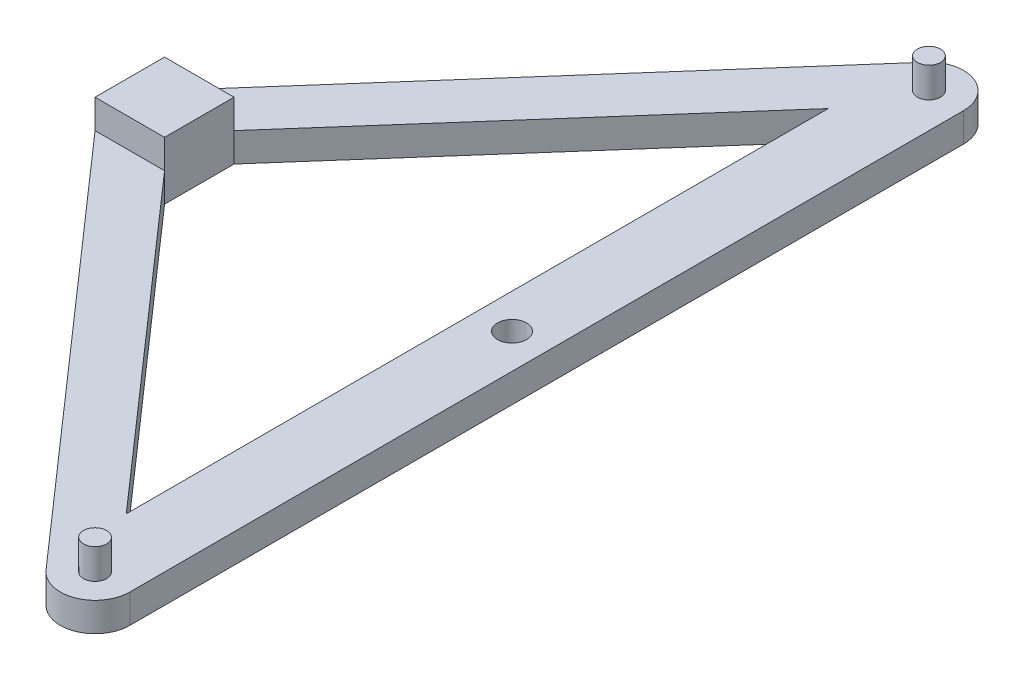
ISO-10303-21;
HEADER;
FILE_DESCRIPTION(('STEP AP214'),'2;1');
FILE_NAME('part.step','',(''),(''),'','','');
FILE_SCHEMA(('AUTOMOTIVE_DESIGN { 1 0 10303 214 1 1 1 1 }'));
ENDSEC;
DATA;
#1=APPLICATION_CONTEXT('core data for automotive mechanical design processes');
#2=APPLICATION_PROTOCOL_DEFINITION('international standard','automotive_design',2000,#1);
#3=PRODUCT_CONTEXT('',#1,'mechanical');
#4=PRODUCT('Part','Part','',(#3));
#5=PRODUCT_RELATED_PRODUCT_CATEGORY('part','',(#4));
#6=PRODUCT_DEFINITION_FORMATION('','',#4);
#7=PRODUCT_DEFINITION_CONTEXT('part definition',#1,'design');
#8=PRODUCT_DEFINITION('design','',#6,#7);
#9=PRODUCT_DEFINITION_SHAPE('','',#8);
#10=(LENGTH_UNIT() NAMED_UNIT(*) SI_UNIT(.MILLI.,.METRE.));
#11=(NAMED_UNIT(*) PLANE_ANGLE_UNIT() SI_UNIT($,.RADIAN.));
#12=(NAMED_UNIT(*) SI_UNIT($,.STERADIAN.) SOLID_ANGLE_UNIT());
#13=UNCERTAINTY_MEASURE_WITH_UNIT(LENGTH_MEASURE(1.E-05),#10,'distance_accuracy_value','');
#14=(GEOMETRIC_REPRESENTATION_CONTEXT(3) GLOBAL_UNCERTAINTY_ASSIGNED_CONTEXT((#13)) GLOBAL_UNIT_ASSIGNED_CONTEXT((#10,
#11,#12)) REPRESENTATION_CONTEXT('',''));
#15=CARTESIAN_POINT('',(0.,0.,0.));
#16=DIRECTION('',(0.,0.,1.));
#17=DIRECTION('',(1.,0.,0.));
#18=AXIS2_PLACEMENT_3D('',#15,#16,#17);
#19=CARTESIAN_POINT('',(3.81,3.175,0.));
#20=DIRECTION('',(1.,0.,0.));
#21=DIRECTION('',(0.,0.,-1.));
#22=AXIS2_PLACEMENT_3D('',#19,#20,#21);
#23=PLANE('',#22);
#24=DIRECTION('',(0.,0.,1.));
#25=VECTOR('',#24,1.);
#26=CARTESIAN_POINT('',(3.81,0.,0.));
#27=LINE('',#26,#25);
#28=CARTESIAN_POINT('',(3.80999999999999,0.,-45.72));
#29=VERTEX_POINT('',#28);
#30=CARTESIAN_POINT('',(3.81,0.,45.72));
#31=VERTEX_POINT('',#30);
#32=EDGE_CURVE('E143',#29,#31,#27,.T.);
#33=ORIENTED_EDGE('',*,*,#32,.F.);
#34=DIRECTION('',(0.,-1.,0.));
#35=VECTOR('',#34,1.);
#36=CARTESIAN_POINT('',(3.80999999999999,3.175,-45.72));
#37=LINE('',#36,#35);
#38=CARTESIAN_POINT('',(3.80999999999999,3.175,-45.72));
#39=VERTEX_POINT('',#38);
#40=EDGE_CURVE('E11',#39,#29,#37,.T.);
#41=ORIENTED_EDGE('',*,*,#40,.F.);
#42=DIRECTION('',(0.,0.,1.));
#43=VECTOR('',#42,1.);
#44=CARTESIAN_POINT('',(3.81,3.175,0.));
#45=LINE('',#44,#43);
#46=CARTESIAN_POINT('',(3.81,3.175,45.72));
#47=VERTEX_POINT('',#46);
#48=EDGE_CURVE('E161',#39,#47,#45,.T.);
#49=ORIENTED_EDGE('',*,*,#48,.T.);
#50=DIRECTION('',(0.,-1.,0.));
#51=VECTOR('',#50,1.);
#52=CARTESIAN_POINT('',(3.81,3.175,45.72));
#53=LINE('',#52,#51);
#54=EDGE_CURVE('E85',#47,#31,#53,.T.);
#55=ORIENTED_EDGE('',*,*,#54,.T.);
#56=EDGE_LOOP('',(#33,#41,#49,#55));
#57=FACE_BOUND('',#56,.T.);
#58=ADVANCED_FACE('F33',(#57),#23,.T.);
#59=CARTESIAN_POINT('',(0.,3.175,-45.72));
#60=DIRECTION('',(0.,-1.,0.));
#61=DIRECTION('',(0.,0.,-1.));
#62=AXIS2_PLACEMENT_3D('',#59,#60,#61);
#63=CYLINDRICAL_SURFACE('',#62,3.81000000000001);
#64=CARTESIAN_POINT('',(0.,0.,-45.72));
#65=DIRECTION('',(0.,1.,0.));
#66=DIRECTION('',(0.,0.,1.));
#67=AXIS2_PLACEMENT_3D('',#64,#65,#66);
#68=CIRCLE('',#67,3.81000000000001);
#69=CARTESIAN_POINT('',(-2.8616866178523,0.,-48.2353229814887));
#70=VERTEX_POINT('',#69);
#71=EDGE_CURVE('E146',#29,#70,#68,.T.);
#72=ORIENTED_EDGE('',*,*,#71,.T.);
#73=DIRECTION('',(0.,-1.,0.));
#74=VECTOR('',#73,1.);
#75=CARTESIAN_POINT('',(-2.8616866178523,3.175,-48.2353229814887));
#76=LINE('',#75,#74);
#77=CARTESIAN_POINT('',(-2.8616866178523,3.175,-48.2353229814887));
#78=VERTEX_POINT('',#77);
#79=EDGE_CURVE('E41',#78,#70,#76,.T.);
#80=ORIENTED_EDGE('',*,*,#79,.F.);
#81=CARTESIAN_POINT('',(0.,3.175,-45.72));
#82=DIRECTION('',(0.,1.,0.));
#83=DIRECTION('',(0.,0.,1.));
#84=AXIS2_PLACEMENT_3D('',#81,#82,#83);
#85=CIRCLE('',#84,3.81000000000001);
#86=EDGE_CURVE('E216',#39,#78,#85,.T.);
#87=ORIENTED_EDGE('',*,*,#86,.F.);
#88=ORIENTED_EDGE('',*,*,#40,.T.);
#89=EDGE_LOOP('',(#72,#80,#87,#88));
#90=FACE_BOUND('',#89,.T.);
#91=ADVANCED_FACE('F182',(#90),#63,.T.);
#92=CARTESIAN_POINT('',(-25.5327609980176,3.175,-22.4424086545754));
#93=DIRECTION('',(-0.751098849830001,0.,-0.66018975892091));
#94=DIRECTION('',(-0.66018975892091,0.,0.751098849830001));
#95=AXIS2_PLACEMENT_3D('',#92,#93,#94);
#96=PLANE('',#95);
#97=DIRECTION('',(0.66018975892091,0.,-0.751098849830001));
#98=VECTOR('',#97,1.);
#99=CARTESIAN_POINT('',(-25.5327609980176,0.,-22.4424086545754));
#100=LINE('',#99,#98);
#101=CARTESIAN_POINT('',(-41.91,0.,-3.81));
#102=VERTEX_POINT('',#101);
#103=EDGE_CURVE('E150',#102,#70,#100,.T.);
#104=ORIENTED_EDGE('',*,*,#103,.F.);
#105=DIRECTION('',(0.,-1.,0.));
#106=VECTOR('',#105,1.);
#107=CARTESIAN_POINT('',(-41.91,3.175,-3.81));
#108=LINE('',#107,#106);
#109=CARTESIAN_POINT('',(-41.91,3.175,-3.81));
#110=VERTEX_POINT('',#109);
#111=EDGE_CURVE('E172',#110,#102,#108,.T.);
#112=ORIENTED_EDGE('',*,*,#111,.F.);
#113=DIRECTION('',(0.66018975892091,0.,-0.751098849830001));
#114=VECTOR('',#113,1.);
#115=CARTESIAN_POINT('',(-25.5327609980176,3.175,-22.4424086545754));
#116=LINE('',#115,#114);
#117=EDGE_CURVE('E179',#110,#78,#116,.T.);
#118=ORIENTED_EDGE('',*,*,#117,.T.);
#119=ORIENTED_EDGE('',*,*,#79,.T.);
#120=EDGE_LOOP('',(#104,#112,#118,#119));
#121=FACE_BOUND('',#120,.T.);
#122=ADVANCED_FACE('F177',(#121),#96,.T.);
#123=CARTESIAN_POINT('',(-21.2339419435321,3.175,-18.6638962578812));
#124=DIRECTION('',(-0.751098849830001,0.,-0.66018975892091));
#125=DIRECTION('',(-0.66018975892091,0.,0.751098849830001));
#126=AXIS2_PLACEMENT_3D('',#123,#124,#125);
#127=PLANE('',#126);
#128=DIRECTION('',(0.66018975892091,0.,-0.751098849830001));
#129=VECTOR('',#128,1.);
#130=CARTESIAN_POINT('',(-21.2339419435321,0.,-18.6638962578812));
#131=LINE('',#130,#129);
#132=CARTESIAN_POINT('',(-34.29,0.,-3.81));
#133=VERTEX_POINT('',#132);
#134=CARTESIAN_POINT('',(-3.81,0.,-38.4871403728501));
#135=VERTEX_POINT('',#134);
#136=EDGE_CURVE('E153',#133,#135,#131,.T.);
#137=ORIENTED_EDGE('',*,*,#136,.T.);
#138=DIRECTION('',(0.,-1.,0.));
#139=VECTOR('',#138,1.);
#140=CARTESIAN_POINT('',(-3.81,3.175,-38.4871403728501));
#141=LINE('',#140,#139);
#142=CARTESIAN_POINT('',(-3.81,3.175,-38.4871403728501));
#143=VERTEX_POINT('',#142);
#144=EDGE_CURVE('E128',#143,#135,#141,.T.);
#145=ORIENTED_EDGE('',*,*,#144,.F.);
#146=DIRECTION('',(0.66018975892091,0.,-0.751098849830001));
#147=VECTOR('',#146,1.);
#148=CARTESIAN_POINT('',(-21.2339419435321,3.175,-18.6638962578812));
#149=LINE('',#148,#147);
#150=CARTESIAN_POINT('',(-34.29,3.175,-3.81));
#151=VERTEX_POINT('',#150);
#152=EDGE_CURVE('E115',#151,#143,#149,.T.);
#153=ORIENTED_EDGE('',*,*,#152,.F.);
#154=DIRECTION('',(0.,-1.,0.));
#155=VECTOR('',#154,1.);
#156=CARTESIAN_POINT('',(-34.29,3.175,-3.81));
#157=LINE('',#156,#155);
#158=EDGE_CURVE('E169',#151,#133,#157,.T.);
#159=ORIENTED_EDGE('',*,*,#158,.T.);
#160=EDGE_LOOP('',(#137,#145,#153,#159));
#161=FACE_BOUND('',#160,.T.);
#162=ADVANCED_FACE('F225',(#161),#127,.F.);
#163=CARTESIAN_POINT('',(-3.81,3.175,0.));
#164=DIRECTION('',(1.,0.,0.));
#165=DIRECTION('',(0.,0.,-1.));
#166=AXIS2_PLACEMENT_3D('',#163,#164,#165);
#167=PLANE('',#166);
#168=DIRECTION('',(0.,0.,1.));
#169=VECTOR('',#168,1.);
#170=CARTESIAN_POINT('',(-3.81,0.,0.));
#171=LINE('',#170,#169);
#172=CARTESIAN_POINT('',(-3.81,0.,38.4871403728501));
#173=VERTEX_POINT('',#172);
#174=EDGE_CURVE('E124',#135,#173,#171,.T.);
#175=ORIENTED_EDGE('',*,*,#174,.T.);
#176=DIRECTION('',(0.,-1.,0.));
#177=VECTOR('',#176,1.);
#178=CARTESIAN_POINT('',(-3.81,3.175,38.4871403728501));
#179=LINE('',#178,#177);
#180=CARTESIAN_POINT('',(-3.81,3.175,38.4871403728501));
#181=VERTEX_POINT('',#180);
#182=EDGE_CURVE('E121',#181,#173,#179,.T.);
#183=ORIENTED_EDGE('',*,*,#182,.F.);
#184=DIRECTION('',(0.,0.,1.));
#185=VECTOR('',#184,1.);
#186=CARTESIAN_POINT('',(-3.81,3.175,0.));
#187=LINE('',#186,#185);
#188=EDGE_CURVE('E107',#143,#181,#187,.T.);
#189=ORIENTED_EDGE('',*,*,#188,.F.);
#190=ORIENTED_EDGE('',*,*,#144,.T.);
#191=EDGE_LOOP('',(#175,#183,#189,#190));
#192=FACE_BOUND('',#191,.T.);
#193=ADVANCED_FACE('F122',(#192),#167,.F.);
#194=CARTESIAN_POINT('',(-21.2339419435321,3.175,18.6638962578812));
#195=DIRECTION('',(0.751098849830001,0.,-0.66018975892091));
#196=DIRECTION('',(-0.66018975892091,0.,-0.751098849830001));
#197=AXIS2_PLACEMENT_3D('',#194,#195,#196);
#198=PLANE('',#197);
#199=DIRECTION('',(0.66018975892091,0.,0.751098849830001));
#200=VECTOR('',#199,1.);
#201=CARTESIAN_POINT('',(-21.2339419435321,0.,18.6638962578812));
#202=LINE('',#201,#200);
#203=CARTESIAN_POINT('',(-34.29,0.,3.81));
#204=VERTEX_POINT('',#203);
#205=EDGE_CURVE('E156',#204,#173,#202,.T.);
#206=ORIENTED_EDGE('',*,*,#205,.F.);
#207=DIRECTION('',(0.,-1.,0.));
#208=VECTOR('',#207,1.);
#209=CARTESIAN_POINT('',(-34.29,3.175,3.81));
#210=LINE('',#209,#208);
#211=CARTESIAN_POINT('',(-34.29,3.175,3.81));
#212=VERTEX_POINT('',#211);
#213=EDGE_CURVE('E129',#212,#204,#210,.T.);
#214=ORIENTED_EDGE('',*,*,#213,.F.);
#215=DIRECTION('',(0.66018975892091,0.,0.751098849830001));
#216=VECTOR('',#215,1.);
#217=CARTESIAN_POINT('',(-21.2339419435321,3.175,18.6638962578812));
#218=LINE('',#217,#216);
#219=EDGE_CURVE('E113',#212,#181,#218,.T.);
#220=ORIENTED_EDGE('',*,*,#219,.T.);
#221=ORIENTED_EDGE('',*,*,#182,.T.);
#222=EDGE_LOOP('',(#206,#214,#220,#221));
#223=FACE_BOUND('',#222,.T.);
#224=ADVANCED_FACE('F132',(#223),#198,.T.);
#225=CARTESIAN_POINT('',(-25.5327609980176,3.175,22.4424086545754));
#226=DIRECTION('',(0.751098849830001,0.,-0.66018975892091));
#227=DIRECTION('',(-0.66018975892091,0.,-0.751098849830001));
#228=AXIS2_PLACEMENT_3D('',#225,#226,#227);
#229=PLANE('',#228);
#230=DIRECTION('',(0.66018975892091,0.,0.751098849830001));
#231=VECTOR('',#230,1.);
#232=CARTESIAN_POINT('',(-25.5327609980176,0.,22.4424086545754));
#233=LINE('',#232,#231);
#234=CARTESIAN_POINT('',(-41.91,0.,3.81));
#235=VERTEX_POINT('',#234);
#236=CARTESIAN_POINT('',(-2.86168661785231,0.,48.2353229814887));
#237=VERTEX_POINT('',#236);
#238=EDGE_CURVE('E78',#235,#237,#233,.T.);
#239=ORIENTED_EDGE('',*,*,#238,.T.);
#240=DIRECTION('',(0.,-1.,0.));
#241=VECTOR('',#240,1.);
#242=CARTESIAN_POINT('',(-2.86168661785231,3.175,48.2353229814887));
#243=LINE('',#242,#241);
#244=CARTESIAN_POINT('',(-2.86168661785231,3.175,48.2353229814887));
#245=VERTEX_POINT('',#244);
#246=EDGE_CURVE('E163',#245,#237,#243,.T.);
#247=ORIENTED_EDGE('',*,*,#246,.F.);
#248=DIRECTION('',(0.66018975892091,0.,0.751098849830001));
#249=VECTOR('',#248,1.);
#250=CARTESIAN_POINT('',(-25.5327609980176,3.175,22.4424086545754));
#251=LINE('',#250,#249);
#252=CARTESIAN_POINT('',(-41.91,3.175,3.81));
#253=VERTEX_POINT('',#252);
#254=EDGE_CURVE('E137',#253,#245,#251,.T.);
#255=ORIENTED_EDGE('',*,*,#254,.F.);
#256=DIRECTION('',(0.,-1.,0.));
#257=VECTOR('',#256,1.);
#258=CARTESIAN_POINT('',(-41.91,3.175,3.81));
#259=LINE('',#258,#257);
#260=EDGE_CURVE('E165',#253,#235,#259,.T.);
#261=ORIENTED_EDGE('',*,*,#260,.T.);
#262=EDGE_LOOP('',(#239,#247,#255,#261));
#263=FACE_BOUND('',#262,.T.);
#264=ADVANCED_FACE('F274',(#263),#229,.F.);
#265=CARTESIAN_POINT('',(0.,3.175,45.72));
#266=DIRECTION('',(0.,-1.,0.));
#267=DIRECTION('',(0.,0.,-1.));
#268=AXIS2_PLACEMENT_3D('',#265,#266,#267);
#269=CYLINDRICAL_SURFACE('',#268,3.80999999999999);
#270=CARTESIAN_POINT('',(0.,0.,45.72));
#271=DIRECTION('',(0.,1.,0.));
#272=DIRECTION('',(0.,0.,1.));
#273=AXIS2_PLACEMENT_3D('',#270,#271,#272);
#274=CIRCLE('',#273,3.80999999999999);
#275=EDGE_CURVE('E159',#237,#31,#274,.T.);
#276=ORIENTED_EDGE('',*,*,#275,.T.);
#277=ORIENTED_EDGE('',*,*,#54,.F.);
#278=CARTESIAN_POINT('',(0.,3.175,45.72));
#279=DIRECTION('',(0.,1.,0.));
#280=DIRECTION('',(0.,0.,1.));
#281=AXIS2_PLACEMENT_3D('',#278,#279,#280);
#282=CIRCLE('',#281,3.80999999999999);
#283=EDGE_CURVE('E49',#245,#47,#282,.T.);
#284=ORIENTED_EDGE('',*,*,#283,.F.);
#285=ORIENTED_EDGE('',*,*,#246,.T.);
#286=EDGE_LOOP('',(#276,#277,#284,#285));
#287=FACE_BOUND('',#286,.T.);
#288=ADVANCED_FACE('F263',(#287),#269,.T.);
#289=CARTESIAN_POINT('',(0.,3.175,0.));
#290=DIRECTION('',(0.,1.,0.));
#291=DIRECTION('',(0.,0.,1.));
#292=AXIS2_PLACEMENT_3D('',#289,#290,#291);
#293=PLANE('',#292);
#294=CARTESIAN_POINT('',(0.,3.175,45.72));
#295=DIRECTION('',(0.,1.,0.));
#296=DIRECTION('',(0.,0.,1.));
#297=AXIS2_PLACEMENT_3D('',#294,#295,#296);
#298=CIRCLE('',#297,1.27);
#299=CARTESIAN_POINT('',(0.,3.175,44.45));
#300=VERTEX_POINT('',#299);
#301=EDGE_CURVE('E293',#300,#300,#298,.T.);
#302=ORIENTED_EDGE('',*,*,#301,.F.);
#303=EDGE_LOOP('',(#302));
#304=FACE_BOUND('',#303,.T.);
#305=CARTESIAN_POINT('',(0.,3.175,-45.72));
#306=DIRECTION('',(0.,1.,0.));
#307=DIRECTION('',(0.,0.,1.));
#308=AXIS2_PLACEMENT_3D('',#305,#306,#307);
#309=CIRCLE('',#308,1.27);
#310=CARTESIAN_POINT('',(0.,3.175,-46.99));
#311=VERTEX_POINT('',#310);
#312=EDGE_CURVE('E287',#311,#311,#309,.T.);
#313=ORIENTED_EDGE('',*,*,#312,.F.);
#314=EDGE_LOOP('',(#313));
#315=FACE_BOUND('',#314,.T.);
#316=CARTESIAN_POINT('',(0.,3.175,0.));
#317=DIRECTION('',(0.,1.,0.));
#318=DIRECTION('',(0.,0.,1.));
#319=AXIS2_PLACEMENT_3D('',#316,#317,#318);
#320=CIRCLE('',#319,1.5875);
#321=CARTESIAN_POINT('',(0.,3.175,1.5875));
#322=VERTEX_POINT('',#321);
#323=EDGE_CURVE('E283',#322,#322,#320,.T.);
#324=ORIENTED_EDGE('',*,*,#323,.F.);
#325=EDGE_LOOP('',(#324));
#326=FACE_BOUND('',#325,.T.);
#327=ORIENTED_EDGE('',*,*,#48,.F.);
#328=ORIENTED_EDGE('',*,*,#86,.T.);
#329=ORIENTED_EDGE('',*,*,#117,.F.);
#330=DIRECTION('',(1.,0.,0.));
#331=VECTOR('',#330,1.);
#332=CARTESIAN_POINT('',(0.,3.175,-3.81));
#333=LINE('',#332,#331);
#334=EDGE_CURVE('E219',#110,#151,#333,.T.);
#335=ORIENTED_EDGE('',*,*,#334,.T.);
#336=ORIENTED_EDGE('',*,*,#152,.T.);
#337=ORIENTED_EDGE('',*,*,#188,.T.);
#338=ORIENTED_EDGE('',*,*,#219,.F.);
#339=DIRECTION('',(1.,0.,0.));
#340=VECTOR('',#339,1.);
#341=CARTESIAN_POINT('',(0.,3.175,3.81));
#342=LINE('',#341,#340);
#343=EDGE_CURVE('E134',#253,#212,#342,.T.);
#344=ORIENTED_EDGE('',*,*,#343,.F.);
#345=ORIENTED_EDGE('',*,*,#254,.T.);
#346=ORIENTED_EDGE('',*,*,#283,.T.);
#347=EDGE_LOOP('',(#327,#328,#329,#335,#336,#337,#338,#344,#345,#346));
#348=FACE_BOUND('',#347,.T.);
#349=ADVANCED_FACE('F109',(#304,#315,#326,#348),#293,.T.);
#350=CARTESIAN_POINT('',(0.,0.,0.));
#351=DIRECTION('',(0.,1.,0.));
#352=DIRECTION('',(0.,0.,1.));
#353=AXIS2_PLACEMENT_3D('',#350,#351,#352);
#354=PLANE('',#353);
#355=CARTESIAN_POINT('',(0.,0.,0.));
#356=DIRECTION('',(0.,1.,0.));
#357=DIRECTION('',(0.,0.,1.));
#358=AXIS2_PLACEMENT_3D('',#355,#356,#357);
#359=CIRCLE('',#358,1.5875);
#360=CARTESIAN_POINT('',(0.,0.,1.5875));
#361=VERTEX_POINT('',#360);
#362=EDGE_CURVE('E199',#361,#361,#359,.F.);
#363=ORIENTED_EDGE('',*,*,#362,.F.);
#364=EDGE_LOOP('',(#363));
#365=FACE_BOUND('',#364,.T.);
#366=ORIENTED_EDGE('',*,*,#136,.F.);
#367=DIRECTION('',(0.,0.,-1.));
#368=VECTOR('',#367,1.);
#369=CARTESIAN_POINT('',(-34.29,0.,3.81));
#370=LINE('',#369,#368);
#371=EDGE_CURVE('E193',#204,#133,#370,.T.);
#372=ORIENTED_EDGE('',*,*,#371,.F.);
#373=ORIENTED_EDGE('',*,*,#205,.T.);
#374=ORIENTED_EDGE('',*,*,#174,.F.);
#375=EDGE_LOOP('',(#366,#372,#373,#374));
#376=FACE_BOUND('',#375,.T.);
#377=ORIENTED_EDGE('',*,*,#32,.T.);
#378=ORIENTED_EDGE('',*,*,#275,.F.);
#379=ORIENTED_EDGE('',*,*,#238,.F.);
#380=DIRECTION('',(0.,0.,1.));
#381=VECTOR('',#380,1.);
#382=CARTESIAN_POINT('',(-41.91,0.,3.81));
#383=LINE('',#382,#381);
#384=EDGE_CURVE('E187',#102,#235,#383,.T.);
#385=ORIENTED_EDGE('',*,*,#384,.F.);
#386=ORIENTED_EDGE('',*,*,#103,.T.);
#387=ORIENTED_EDGE('',*,*,#71,.F.);
#388=EDGE_LOOP('',(#377,#378,#379,#385,#386,#387));
#389=FACE_BOUND('',#388,.T.);
#390=ADVANCED_FACE('F185',(#365,#376,#389),#354,.F.);
#391=CARTESIAN_POINT('',(-34.29,6.35,3.81));
#392=DIRECTION('',(-1.,0.,0.));
#393=DIRECTION('',(0.,0.,1.));
#394=AXIS2_PLACEMENT_3D('',#391,#392,#393);
#395=PLANE('',#394);
#396=ORIENTED_EDGE('',*,*,#371,.T.);
#397=ORIENTED_EDGE('',*,*,#158,.F.);
#398=DIRECTION('',(0.,-1.,0.));
#399=VECTOR('',#398,1.);
#400=CARTESIAN_POINT('',(-34.29,6.35,-3.81));
#401=LINE('',#400,#399);
#402=CARTESIAN_POINT('',(-34.29,6.35,-3.81));
#403=VERTEX_POINT('',#402);
#404=EDGE_CURVE('E147',#403,#151,#401,.T.);
#405=ORIENTED_EDGE('',*,*,#404,.F.);
#406=DIRECTION('',(0.,0.,-1.));
#407=VECTOR('',#406,1.);
#408=CARTESIAN_POINT('',(-34.29,6.35,3.81));
#409=LINE('',#408,#407);
#410=CARTESIAN_POINT('',(-34.29,6.35,3.81));
#411=VERTEX_POINT('',#410);
#412=EDGE_CURVE('E192',#411,#403,#409,.T.);
#413=ORIENTED_EDGE('',*,*,#412,.F.);
#414=DIRECTION('',(0.,-1.,0.));
#415=VECTOR('',#414,1.);
#416=CARTESIAN_POINT('',(-34.29,6.35,3.81));
#417=LINE('',#416,#415);
#418=EDGE_CURVE('E203',#411,#212,#417,.T.);
#419=ORIENTED_EDGE('',*,*,#418,.T.);
#420=ORIENTED_EDGE('',*,*,#213,.T.);
#421=EDGE_LOOP('',(#396,#397,#405,#413,#419,#420));
#422=FACE_BOUND('',#421,.T.);
#423=ADVANCED_FACE('F229',(#422),#395,.F.);
#424=CARTESIAN_POINT('',(-41.91,6.35,-3.81));
#425=DIRECTION('',(0.,0.,1.));
#426=DIRECTION('',(1.,0.,0.));
#427=AXIS2_PLACEMENT_3D('',#424,#425,#426);
#428=PLANE('',#427);
#429=ORIENTED_EDGE('',*,*,#334,.F.);
#430=DIRECTION('',(0.,-1.,0.));
#431=VECTOR('',#430,1.);
#432=CARTESIAN_POINT('',(-41.91,6.35,-3.81));
#433=LINE('',#432,#431);
#434=CARTESIAN_POINT('',(-41.91,6.35,-3.81));
#435=VERTEX_POINT('',#434);
#436=EDGE_CURVE('E210',#435,#110,#433,.T.);
#437=ORIENTED_EDGE('',*,*,#436,.F.);
#438=DIRECTION('',(-1.,0.,0.));
#439=VECTOR('',#438,1.);
#440=CARTESIAN_POINT('',(-41.91,6.35,-3.81));
#441=LINE('',#440,#439);
#442=EDGE_CURVE('E196',#403,#435,#441,.T.);
#443=ORIENTED_EDGE('',*,*,#442,.F.);
#444=ORIENTED_EDGE('',*,*,#404,.T.);
#445=EDGE_LOOP('',(#429,#437,#443,#444));
#446=FACE_BOUND('',#445,.T.);
#447=ADVANCED_FACE('F233',(#446),#428,.F.);
#448=CARTESIAN_POINT('',(-41.91,6.35,3.81));
#449=DIRECTION('',(1.,0.,0.));
#450=DIRECTION('',(0.,0.,-1.));
#451=AXIS2_PLACEMENT_3D('',#448,#449,#450);
#452=PLANE('',#451);
#453=CARTESIAN_POINT('',(-41.91,3.175,0.));
#454=DIRECTION('',(-1.,0.,0.));
#455=DIRECTION('',(0.,0.,1.));
#456=AXIS2_PLACEMENT_3D('',#453,#454,#455);
#457=CIRCLE('',#456,1.651);
#458=CARTESIAN_POINT('',(-41.91,3.175,1.651));
#459=VERTEX_POINT('',#458);
#460=EDGE_CURVE('E299',#459,#459,#457,.T.);
#461=ORIENTED_EDGE('',*,*,#460,.F.);
#462=EDGE_LOOP('',(#461));
#463=FACE_BOUND('',#462,.T.);
#464=ORIENTED_EDGE('',*,*,#384,.T.);
#465=ORIENTED_EDGE('',*,*,#260,.F.);
#466=DIRECTION('',(0.,-1.,0.));
#467=VECTOR('',#466,1.);
#468=CARTESIAN_POINT('',(-41.91,6.35,3.81));
#469=LINE('',#468,#467);
#470=CARTESIAN_POINT('',(-41.91,6.35,3.81));
#471=VERTEX_POINT('',#470);
#472=EDGE_CURVE('E206',#471,#253,#469,.T.);
#473=ORIENTED_EDGE('',*,*,#472,.F.);
#474=DIRECTION('',(0.,0.,1.));
#475=VECTOR('',#474,1.);
#476=CARTESIAN_POINT('',(-41.91,6.35,3.81));
#477=LINE('',#476,#475);
#478=EDGE_CURVE('E240',#435,#471,#477,.T.);
#479=ORIENTED_EDGE('',*,*,#478,.F.);
#480=ORIENTED_EDGE('',*,*,#436,.T.);
#481=ORIENTED_EDGE('',*,*,#111,.T.);
#482=EDGE_LOOP('',(#464,#465,#473,#479,#480,#481));
#483=FACE_BOUND('',#482,.T.);
#484=ADVANCED_FACE('F278',(#463,#483),#452,.F.);
#485=CARTESIAN_POINT('',(-41.91,6.35,3.81));
#486=DIRECTION('',(0.,0.,-1.));
#487=DIRECTION('',(-1.,0.,0.));
#488=AXIS2_PLACEMENT_3D('',#485,#486,#487);
#489=PLANE('',#488);
#490=ORIENTED_EDGE('',*,*,#343,.T.);
#491=ORIENTED_EDGE('',*,*,#418,.F.);
#492=DIRECTION('',(1.,0.,0.));
#493=VECTOR('',#492,1.);
#494=CARTESIAN_POINT('',(-41.91,6.35,3.81));
#495=LINE('',#494,#493);
#496=EDGE_CURVE('E207',#471,#411,#495,.T.);
#497=ORIENTED_EDGE('',*,*,#496,.F.);
#498=ORIENTED_EDGE('',*,*,#472,.T.);
#499=EDGE_LOOP('',(#490,#491,#497,#498));
#500=FACE_BOUND('',#499,.T.);
#501=ADVANCED_FACE('F276',(#500),#489,.F.);
#502=CARTESIAN_POINT('',(0.,6.35,0.));
#503=DIRECTION('',(0.,-1.,0.));
#504=DIRECTION('',(0.,0.,-1.));
#505=AXIS2_PLACEMENT_3D('',#502,#503,#504);
#506=PLANE('',#505);
#507=ORIENTED_EDGE('',*,*,#412,.T.);
#508=ORIENTED_EDGE('',*,*,#442,.T.);
#509=ORIENTED_EDGE('',*,*,#478,.T.);
#510=ORIENTED_EDGE('',*,*,#496,.T.);
#511=EDGE_LOOP('',(#507,#508,#509,#510));
#512=FACE_BOUND('',#511,.T.);
#513=ADVANCED_FACE('F243',(#512),#506,.F.);
#514=CARTESIAN_POINT('',(0.,-4.49012806053458,0.));
#515=DIRECTION('',(0.,1.,0.));
#516=DIRECTION('',(0.,0.,1.));
#517=AXIS2_PLACEMENT_3D('',#514,#515,#516);
#518=CYLINDRICAL_SURFACE('',#517,1.5875);
#519=CARTESIAN_POINT('',(0.,0.,1.5875));
#520=CARTESIAN_POINT('',(0.,0.0330729166666659,1.5875));
#521=CARTESIAN_POINT('',(0.,0.0661458333333327,1.5875));
#522=CARTESIAN_POINT('',(0.,0.132291666666666,1.5875));
#523=CARTESIAN_POINT('',(0.,0.165364583333332,1.5875));
#524=CARTESIAN_POINT('',(0.,0.231510416666666,1.5875));
#525=CARTESIAN_POINT('',(0.,0.264583333333333,1.5875));
#526=CARTESIAN_POINT('',(0.,0.330729166666666,1.5875));
#527=CARTESIAN_POINT('',(0.,0.363802083333332,1.5875));
#528=CARTESIAN_POINT('',(0.,0.429947916666666,1.5875));
#529=CARTESIAN_POINT('',(0.,0.463020833333332,1.5875));
#530=CARTESIAN_POINT('',(0.,0.529166666666666,1.5875));
#531=CARTESIAN_POINT('',(0.,0.562239583333333,1.5875));
#532=CARTESIAN_POINT('',(0.,0.628385416666666,1.5875));
#533=CARTESIAN_POINT('',(0.,0.661458333333332,1.5875));
#534=CARTESIAN_POINT('',(0.,0.727604166666666,1.5875));
#535=CARTESIAN_POINT('',(0.,0.760677083333333,1.5875));
#536=CARTESIAN_POINT('',(0.,0.826822916666666,1.5875));
#537=CARTESIAN_POINT('',(0.,0.859895833333333,1.5875));
#538=CARTESIAN_POINT('',(0.,0.926041666666666,1.5875));
#539=CARTESIAN_POINT('',(0.,0.959114583333333,1.5875));
#540=CARTESIAN_POINT('',(0.,1.02526041666667,1.5875));
#541=CARTESIAN_POINT('',(0.,1.05833333333333,1.5875));
#542=CARTESIAN_POINT('',(0.,1.12447916666667,1.5875));
#543=CARTESIAN_POINT('',(0.,1.15755208333333,1.5875));
#544=CARTESIAN_POINT('',(0.,1.22369791666667,1.5875));
#545=CARTESIAN_POINT('',(0.,1.25677083333333,1.5875));
#546=CARTESIAN_POINT('',(0.,1.32291666666667,1.5875));
#547=CARTESIAN_POINT('',(0.,1.35598958333333,1.5875));
#548=CARTESIAN_POINT('',(0.,1.42213541666667,1.5875));
#549=CARTESIAN_POINT('',(0.,1.45520833333333,1.5875));
#550=CARTESIAN_POINT('',(0.,1.52135416666667,1.5875));
#551=CARTESIAN_POINT('',(0.,1.55442708333333,1.5875));
#552=CARTESIAN_POINT('',(0.,1.62057291666667,1.5875));
#553=CARTESIAN_POINT('',(0.,1.65364583333333,1.5875));
#554=CARTESIAN_POINT('',(0.,1.71979166666667,1.5875));
#555=CARTESIAN_POINT('',(0.,1.75286458333333,1.5875));
#556=CARTESIAN_POINT('',(0.,1.81901041666667,1.5875));
#557=CARTESIAN_POINT('',(0.,1.85208333333333,1.5875));
#558=CARTESIAN_POINT('',(0.,1.91822916666667,1.5875));
#559=CARTESIAN_POINT('',(0.,1.95130208333333,1.5875));
#560=CARTESIAN_POINT('',(0.,2.01744791666667,1.5875));
#561=CARTESIAN_POINT('',(0.,2.05052083333333,1.5875));
#562=CARTESIAN_POINT('',(0.,2.11666666666667,1.5875));
#563=CARTESIAN_POINT('',(0.,2.14973958333333,1.5875));
#564=CARTESIAN_POINT('',(0.,2.21588541666667,1.5875));
#565=CARTESIAN_POINT('',(0.,2.24895833333333,1.5875));
#566=CARTESIAN_POINT('',(0.,2.31510416666667,1.5875));
#567=CARTESIAN_POINT('',(0.,2.34817708333333,1.5875));
#568=CARTESIAN_POINT('',(0.,2.41432291666667,1.5875));
#569=CARTESIAN_POINT('',(0.,2.44739583333333,1.5875));
#570=CARTESIAN_POINT('',(0.,2.51354166666667,1.5875));
#571=CARTESIAN_POINT('',(0.,2.54661458333333,1.5875));
#572=CARTESIAN_POINT('',(0.,2.61276041666667,1.5875));
#573=CARTESIAN_POINT('',(0.,2.64583333333333,1.5875));
#574=CARTESIAN_POINT('',(0.,2.71197916666667,1.5875));
#575=CARTESIAN_POINT('',(0.,2.74505208333333,1.5875));
#576=CARTESIAN_POINT('',(0.,2.81119791666667,1.5875));
#577=CARTESIAN_POINT('',(0.,2.84427083333333,1.5875));
#578=CARTESIAN_POINT('',(0.,2.91041666666667,1.5875));
#579=CARTESIAN_POINT('',(0.,2.94348958333333,1.5875));
#580=CARTESIAN_POINT('',(0.,3.00963541666667,1.5875));
#581=CARTESIAN_POINT('',(0.,3.04270833333333,1.5875));
#582=CARTESIAN_POINT('',(0.,3.10885416666667,1.5875));
#583=CARTESIAN_POINT('',(0.,3.14192708333333,1.5875));
#584=CARTESIAN_POINT('',(0.,3.175,1.5875));
#585=B_SPLINE_CURVE_WITH_KNOTS('',3,(#519,#520,#521,#522,#523,#524,#525,#526,#527,#528,#529,
#530,#531,#532,#533,#534,#535,#536,#537,#538,#539,#540,#541,#542,#543,#544,#545,#546,#547,#548,
#549,#550,#551,#552,#553,#554,#555,#556,#557,#558,#559,#560,#561,#562,#563,#564,#565,#566,#567,
#568,#569,#570,#571,#572,#573,#574,#575,#576,#577,#578,#579,#580,#581,#582,#583,#584),
.UNSPECIFIED.,.F.,.F.,(4,2,2,2,2,2,2,2,2,2,2,2,2,2,2,2,2,2,2,2,2,2,2,2,2,2,2,2,2,2,2,2,4),(0.,
0.0992187500000004,0.1984375,0.29765625,0.396875,0.49609375,0.5953125,0.69453125,0.79375,
0.892968750000001,0.9921875,1.09140625,1.190625,1.28984375,1.3890625,1.48828125,1.5875,
1.68671875,1.7859375,1.88515625,1.984375,2.08359375,2.1828125,2.28203125,2.38125,2.48046875,
2.5796875,2.67890625,2.778125,2.87734375,2.9765625,3.07578125,3.175),.UNSPECIFIED.);
#586=EDGE_CURVE('BSEAM325',#361,#322,#585,.T.);
#587=ORIENTED_EDGE('',*,*,#362,.T.);
#588=ORIENTED_EDGE('',*,*,#323,.T.);
#589=ORIENTED_EDGE('',*,*,#586,.T.);
#590=ORIENTED_EDGE('',*,*,#586,.F.);
#591=EDGE_LOOP('',(#587,#589,#588,#590));
#592=FACE_BOUND('',#591,.T.);
#593=ADVANCED_FACE('F325',(#592),#518,.F.);
#594=CARTESIAN_POINT('',(0.,6.477,-45.72));
#595=DIRECTION('',(0.,-1.,0.));
#596=DIRECTION('',(0.,0.,-1.));
#597=AXIS2_PLACEMENT_3D('',#594,#595,#596);
#598=CYLINDRICAL_SURFACE('',#597,1.27);
#599=CARTESIAN_POINT('',(0.,6.477,-45.72));
#600=DIRECTION('',(0.,1.,0.));
#601=DIRECTION('',(0.,0.,1.));
#602=AXIS2_PLACEMENT_3D('',#599,#600,#601);
#603=CIRCLE('',#602,1.27);
#604=CARTESIAN_POINT('',(0.,6.477,-46.99));
#605=VERTEX_POINT('',#604);
#606=EDGE_CURVE('E286',#605,#605,#603,.T.);
#607=CARTESIAN_POINT('',(0.,6.477,-46.99));
#608=CARTESIAN_POINT('',(0.,6.44260416666667,-46.99));
#609=CARTESIAN_POINT('',(0.,6.40820833333333,-46.99));
#610=CARTESIAN_POINT('',(0.,6.33941666666667,-46.99));
#611=CARTESIAN_POINT('',(0.,6.30502083333333,-46.99));
#612=CARTESIAN_POINT('',(0.,6.23622916666667,-46.99));
#613=CARTESIAN_POINT('',(0.,6.20183333333333,-46.99));
#614=CARTESIAN_POINT('',(0.,6.13304166666667,-46.99));
#615=CARTESIAN_POINT('',(0.,6.09864583333333,-46.99));
#616=CARTESIAN_POINT('',(0.,6.02985416666667,-46.99));
#617=CARTESIAN_POINT('',(0.,5.99545833333333,-46.99));
#618=CARTESIAN_POINT('',(0.,5.92666666666667,-46.99));
#619=CARTESIAN_POINT('',(0.,5.89227083333333,-46.99));
#620=CARTESIAN_POINT('',(0.,5.82347916666667,-46.99));
#621=CARTESIAN_POINT('',(0.,5.78908333333333,-46.99));
#622=CARTESIAN_POINT('',(0.,5.72029166666667,-46.99));
#623=CARTESIAN_POINT('',(0.,5.68589583333333,-46.99));
#624=CARTESIAN_POINT('',(0.,5.61710416666667,-46.99));
#625=CARTESIAN_POINT('',(0.,5.58270833333333,-46.99));
#626=CARTESIAN_POINT('',(0.,5.51391666666667,-46.99));
#627=CARTESIAN_POINT('',(0.,5.47952083333333,-46.99));
#628=CARTESIAN_POINT('',(0.,5.41072916666667,-46.99));
#629=CARTESIAN_POINT('',(0.,5.37633333333333,-46.99));
#630=CARTESIAN_POINT('',(0.,5.30754166666667,-46.99));
#631=CARTESIAN_POINT('',(0.,5.27314583333333,-46.99));
#632=CARTESIAN_POINT('',(0.,5.20435416666667,-46.99));
#633=CARTESIAN_POINT('',(0.,5.16995833333333,-46.99));
#634=CARTESIAN_POINT('',(0.,5.10116666666667,-46.99));
#635=CARTESIAN_POINT('',(0.,5.06677083333333,-46.99));
#636=CARTESIAN_POINT('',(0.,4.99797916666667,-46.99));
#637=CARTESIAN_POINT('',(0.,4.96358333333333,-46.99));
#638=CARTESIAN_POINT('',(0.,4.89479166666667,-46.99));
#639=CARTESIAN_POINT('',(0.,4.86039583333333,-46.99));
#640=CARTESIAN_POINT('',(0.,4.79160416666667,-46.99));
#641=CARTESIAN_POINT('',(0.,4.75720833333333,-46.99));
#642=CARTESIAN_POINT('',(0.,4.68841666666667,-46.99));
#643=CARTESIAN_POINT('',(0.,4.65402083333333,-46.99));
#644=CARTESIAN_POINT('',(0.,4.58522916666667,-46.99));
#645=CARTESIAN_POINT('',(0.,4.55083333333333,-46.99));
#646=CARTESIAN_POINT('',(0.,4.48204166666667,-46.99));
#647=CARTESIAN_POINT('',(0.,4.44764583333333,-46.99));
#648=CARTESIAN_POINT('',(0.,4.37885416666667,-46.99));
#649=CARTESIAN_POINT('',(0.,4.34445833333333,-46.99));
#650=CARTESIAN_POINT('',(0.,4.27566666666667,-46.99));
#651=CARTESIAN_POINT('',(0.,4.24127083333333,-46.99));
#652=CARTESIAN_POINT('',(0.,4.17247916666667,-46.99));
#653=CARTESIAN_POINT('',(0.,4.13808333333333,-46.99));
#654=CARTESIAN_POINT('',(0.,4.06929166666667,-46.99));
#655=CARTESIAN_POINT('',(0.,4.03489583333333,-46.99));
#656=CARTESIAN_POINT('',(0.,3.96610416666667,-46.99));
#657=CARTESIAN_POINT('',(0.,3.93170833333333,-46.99));
#658=CARTESIAN_POINT('',(0.,3.86291666666667,-46.99));
#659=CARTESIAN_POINT('',(0.,3.82852083333333,-46.99));
#660=CARTESIAN_POINT('',(0.,3.75972916666667,-46.99));
#661=CARTESIAN_POINT('',(0.,3.72533333333333,-46.99));
#662=CARTESIAN_POINT('',(0.,3.65654166666667,-46.99));
#663=CARTESIAN_POINT('',(0.,3.62214583333333,-46.99));
#664=CARTESIAN_POINT('',(0.,3.55335416666667,-46.99));
#665=CARTESIAN_POINT('',(0.,3.51895833333333,-46.99));
#666=CARTESIAN_POINT('',(0.,3.45016666666667,-46.99));
#667=CARTESIAN_POINT('',(0.,3.41577083333333,-46.99));
#668=CARTESIAN_POINT('',(0.,3.34697916666667,-46.99));
#669=CARTESIAN_POINT('',(0.,3.31258333333333,-46.99));
#670=CARTESIAN_POINT('',(0.,3.24379166666667,-46.99));
#671=CARTESIAN_POINT('',(0.,3.20939583333333,-46.99));
#672=CARTESIAN_POINT('',(0.,3.175,-46.99));
#673=B_SPLINE_CURVE_WITH_KNOTS('',3,(#607,#608,#609,#610,#611,#612,#613,#614,#615,#616,#617,
#618,#619,#620,#621,#622,#623,#624,#625,#626,#627,#628,#629,#630,#631,#632,#633,#634,#635,#636,
#637,#638,#639,#640,#641,#642,#643,#644,#645,#646,#647,#648,#649,#650,#651,#652,#653,#654,#655,
#656,#657,#658,#659,#660,#661,#662,#663,#664,#665,#666,#667,#668,#669,#670,#671,#672),
.UNSPECIFIED.,.F.,.F.,(4,2,2,2,2,2,2,2,2,2,2,2,2,2,2,2,2,2,2,2,2,2,2,2,2,2,2,2,2,2,2,2,4),(0.,
0.103187500000001,0.206375000000001,0.309562500000001,0.412750000000001,0.515937500000001,
0.619125000000001,0.722312500000001,0.825500000000001,0.928687500000001,1.031875,1.1350625,
1.23825,1.3414375,1.444625,1.5478125,1.651,1.7541875,1.857375,1.9605625,2.06375,2.1669375,
2.270125,2.3733125,2.4765,2.5796875,2.682875,2.7860625,2.88925,2.9924375,3.095625,3.1988125,
3.302),.UNSPECIFIED.);
#674=EDGE_CURVE('BSEAM328',#605,#311,#673,.T.);
#675=ORIENTED_EDGE('',*,*,#606,.F.);
#676=ORIENTED_EDGE('',*,*,#312,.T.);
#677=ORIENTED_EDGE('',*,*,#674,.T.);
#678=ORIENTED_EDGE('',*,*,#674,.F.);
#679=EDGE_LOOP('',(#675,#677,#676,#678));
#680=FACE_BOUND('',#679,.T.);
#681=ADVANCED_FACE('F328',(#680),#598,.T.);
#682=CARTESIAN_POINT('',(0.,6.477,-45.72));
#683=DIRECTION('',(0.,1.,0.));
#684=DIRECTION('',(0.,0.,1.));
#685=AXIS2_PLACEMENT_3D('',#682,#683,#684);
#686=PLANE('',#685);
#687=ORIENTED_EDGE('',*,*,#606,.T.);
#688=EDGE_LOOP('',(#687));
#689=FACE_BOUND('',#688,.T.);
#690=ADVANCED_FACE('F332',(#689),#686,.T.);
#691=CARTESIAN_POINT('',(0.,6.477,45.72));
#692=DIRECTION('',(0.,-1.,0.));
#693=DIRECTION('',(0.,0.,-1.));
#694=AXIS2_PLACEMENT_3D('',#691,#692,#693);
#695=CYLINDRICAL_SURFACE('',#694,1.27);
#696=CARTESIAN_POINT('',(0.,6.477,45.72));
#697=DIRECTION('',(0.,1.,0.));
#698=DIRECTION('',(0.,0.,1.));
#699=AXIS2_PLACEMENT_3D('',#696,#697,#698);
#700=CIRCLE('',#699,1.27);
#701=CARTESIAN_POINT('',(0.,6.477,44.45));
#702=VERTEX_POINT('',#701);
#703=EDGE_CURVE('E290',#702,#702,#700,.T.);
#704=CARTESIAN_POINT('',(0.,6.477,44.45));
#705=CARTESIAN_POINT('',(0.,6.44260416666667,44.45));
#706=CARTESIAN_POINT('',(0.,6.40820833333333,44.45));
#707=CARTESIAN_POINT('',(0.,6.33941666666667,44.45));
#708=CARTESIAN_POINT('',(0.,6.30502083333333,44.45));
#709=CARTESIAN_POINT('',(0.,6.23622916666667,44.45));
#710=CARTESIAN_POINT('',(0.,6.20183333333333,44.45));
#711=CARTESIAN_POINT('',(0.,6.13304166666667,44.45));
#712=CARTESIAN_POINT('',(0.,6.09864583333333,44.45));
#713=CARTESIAN_POINT('',(0.,6.02985416666667,44.45));
#714=CARTESIAN_POINT('',(0.,5.99545833333333,44.45));
#715=CARTESIAN_POINT('',(0.,5.92666666666667,44.45));
#716=CARTESIAN_POINT('',(0.,5.89227083333333,44.45));
#717=CARTESIAN_POINT('',(0.,5.82347916666667,44.45));
#718=CARTESIAN_POINT('',(0.,5.78908333333333,44.45));
#719=CARTESIAN_POINT('',(0.,5.72029166666667,44.45));
#720=CARTESIAN_POINT('',(0.,5.68589583333333,44.45));
#721=CARTESIAN_POINT('',(0.,5.61710416666667,44.45));
#722=CARTESIAN_POINT('',(0.,5.58270833333333,44.45));
#723=CARTESIAN_POINT('',(0.,5.51391666666667,44.45));
#724=CARTESIAN_POINT('',(0.,5.47952083333333,44.45));
#725=CARTESIAN_POINT('',(0.,5.41072916666667,44.45));
#726=CARTESIAN_POINT('',(0.,5.37633333333333,44.45));
#727=CARTESIAN_POINT('',(0.,5.30754166666667,44.45));
#728=CARTESIAN_POINT('',(0.,5.27314583333333,44.45));
#729=CARTESIAN_POINT('',(0.,5.20435416666667,44.45));
#730=CARTESIAN_POINT('',(0.,5.16995833333333,44.45));
#731=CARTESIAN_POINT('',(0.,5.10116666666667,44.45));
#732=CARTESIAN_POINT('',(0.,5.06677083333333,44.45));
#733=CARTESIAN_POINT('',(0.,4.99797916666667,44.45));
#734=CARTESIAN_POINT('',(0.,4.96358333333333,44.45));
#735=CARTESIAN_POINT('',(0.,4.89479166666667,44.45));
#736=CARTESIAN_POINT('',(0.,4.86039583333333,44.45));
#737=CARTESIAN_POINT('',(0.,4.79160416666667,44.45));
#738=CARTESIAN_POINT('',(0.,4.75720833333333,44.45));
#739=CARTESIAN_POINT('',(0.,4.68841666666667,44.45));
#740=CARTESIAN_POINT('',(0.,4.65402083333333,44.45));
#741=CARTESIAN_POINT('',(0.,4.58522916666667,44.45));
#742=CARTESIAN_POINT('',(0.,4.55083333333333,44.45));
#743=CARTESIAN_POINT('',(0.,4.48204166666667,44.45));
#744=CARTESIAN_POINT('',(0.,4.44764583333333,44.45));
#745=CARTESIAN_POINT('',(0.,4.37885416666667,44.45));
#746=CARTESIAN_POINT('',(0.,4.34445833333333,44.45));
#747=CARTESIAN_POINT('',(0.,4.27566666666667,44.45));
#748=CARTESIAN_POINT('',(0.,4.24127083333333,44.45));
#749=CARTESIAN_POINT('',(0.,4.17247916666667,44.45));
#750=CARTESIAN_POINT('',(0.,4.13808333333333,44.45));
#751=CARTESIAN_POINT('',(0.,4.06929166666667,44.45));
#752=CARTESIAN_POINT('',(0.,4.03489583333333,44.45));
#753=CARTESIAN_POINT('',(0.,3.96610416666667,44.45));
#754=CARTESIAN_POINT('',(0.,3.93170833333333,44.45));
#755=CARTESIAN_POINT('',(0.,3.86291666666667,44.45));
#756=CARTESIAN_POINT('',(0.,3.82852083333333,44.45));
#757=CARTESIAN_POINT('',(0.,3.75972916666667,44.45));
#758=CARTESIAN_POINT('',(0.,3.72533333333333,44.45));
#759=CARTESIAN_POINT('',(0.,3.65654166666667,44.45));
#760=CARTESIAN_POINT('',(0.,3.62214583333333,44.45));
#761=CARTESIAN_POINT('',(0.,3.55335416666667,44.45));
#762=CARTESIAN_POINT('',(0.,3.51895833333333,44.45));
#763=CARTESIAN_POINT('',(0.,3.45016666666667,44.45));
#764=CARTESIAN_POINT('',(0.,3.41577083333333,44.45));
#765=CARTESIAN_POINT('',(0.,3.34697916666667,44.45));
#766=CARTESIAN_POINT('',(0.,3.31258333333333,44.45));
#767=CARTESIAN_POINT('',(0.,3.24379166666667,44.45));
#768=CARTESIAN_POINT('',(0.,3.20939583333333,44.45));
#769=CARTESIAN_POINT('',(0.,3.175,44.45));
#770=B_SPLINE_CURVE_WITH_KNOTS('',3,(#704,#705,#706,#707,#708,#709,#710,#711,#712,#713,#714,
#715,#716,#717,#718,#719,#720,#721,#722,#723,#724,#725,#726,#727,#728,#729,#730,#731,#732,#733,
#734,#735,#736,#737,#738,#739,#740,#741,#742,#743,#744,#745,#746,#747,#748,#749,#750,#751,#752,
#753,#754,#755,#756,#757,#758,#759,#760,#761,#762,#763,#764,#765,#766,#767,#768,#769),
.UNSPECIFIED.,.F.,.F.,(4,2,2,2,2,2,2,2,2,2,2,2,2,2,2,2,2,2,2,2,2,2,2,2,2,2,2,2,2,2,2,2,4),(0.,
0.103187500000001,0.206375000000001,0.309562500000001,0.412750000000001,0.515937500000001,
0.619125000000001,0.722312500000001,0.825500000000001,0.928687500000001,1.031875,1.1350625,
1.23825,1.3414375,1.444625,1.5478125,1.651,1.7541875,1.857375,1.9605625,2.06375,2.1669375,
2.270125,2.3733125,2.4765,2.5796875,2.682875,2.7860625,2.88925,2.9924375,3.095625,3.1988125,
3.302),.UNSPECIFIED.);
#771=EDGE_CURVE('BSEAM336',#702,#300,#770,.T.);
#772=ORIENTED_EDGE('',*,*,#703,.F.);
#773=ORIENTED_EDGE('',*,*,#301,.T.);
#774=ORIENTED_EDGE('',*,*,#771,.T.);
#775=ORIENTED_EDGE('',*,*,#771,.F.);
#776=EDGE_LOOP('',(#772,#774,#773,#775));
#777=FACE_BOUND('',#776,.T.);
#778=ADVANCED_FACE('F336',(#777),#695,.T.);
#779=CARTESIAN_POINT('',(0.,6.477,45.72));
#780=DIRECTION('',(0.,1.,0.));
#781=DIRECTION('',(0.,0.,1.));
#782=AXIS2_PLACEMENT_3D('',#779,#780,#781);
#783=PLANE('',#782);
#784=ORIENTED_EDGE('',*,*,#703,.T.);
#785=EDGE_LOOP('',(#784));
#786=FACE_BOUND('',#785,.T.);
#787=ADVANCED_FACE('F310',(#786),#783,.T.);
#788=CARTESIAN_POINT('',(-38.735,3.175,0.));
#789=DIRECTION('',(-1.,0.,0.));
#790=DIRECTION('',(0.,0.,1.));
#791=AXIS2_PLACEMENT_3D('',#788,#789,#790);
#792=CYLINDRICAL_SURFACE('',#791,1.651);
#793=CARTESIAN_POINT('',(-38.735,3.175,0.));
#794=DIRECTION('',(-1.,0.,0.));
#795=DIRECTION('',(0.,0.,1.));
#796=AXIS2_PLACEMENT_3D('',#793,#794,#795);
#797=CIRCLE('',#796,1.651);
#798=CARTESIAN_POINT('',(-38.735,3.175,1.651));
#799=VERTEX_POINT('',#798);
#800=EDGE_CURVE('E296',#799,#799,#797,.T.);
#801=ORIENTED_EDGE('',*,*,#800,.F.);
#802=EDGE_LOOP('',(#801));
#803=FACE_BOUND('',#802,.T.);
#804=ORIENTED_EDGE('',*,*,#460,.T.);
#805=EDGE_LOOP('',(#804));
#806=FACE_BOUND('',#805,.T.);
#807=ADVANCED_FACE('F307',(#803,#806),#792,.F.);
#808=CARTESIAN_POINT('',(-38.735,3.175,0.));
#809=DIRECTION('',(-1.,0.,0.));
#810=DIRECTION('',(0.,0.,1.));
#811=AXIS2_PLACEMENT_3D('',#808,#809,#810);
#812=PLANE('',#811);
#813=ORIENTED_EDGE('',*,*,#800,.T.);
#814=EDGE_LOOP('',(#813));
#815=FACE_BOUND('',#814,.T.);
#816=ADVANCED_FACE('F305',(#815),#812,.T.);
#817=CLOSED_SHELL('',(#58,#91,#122,#162,#193,#224,#264,#288,#349,#390,#423,#447,#484,#501,#513,
#593,#681,#690,#778,#787,#807,#816));
#818=MANIFOLD_SOLID_BREP('B2',#817);
#819=ADVANCED_BREP_SHAPE_REPRESENTATION('',(#18,#818),#14);
#820=SHAPE_DEFINITION_REPRESENTATION(#9,#819);
ENDSEC;
END-ISO-10303-21;
